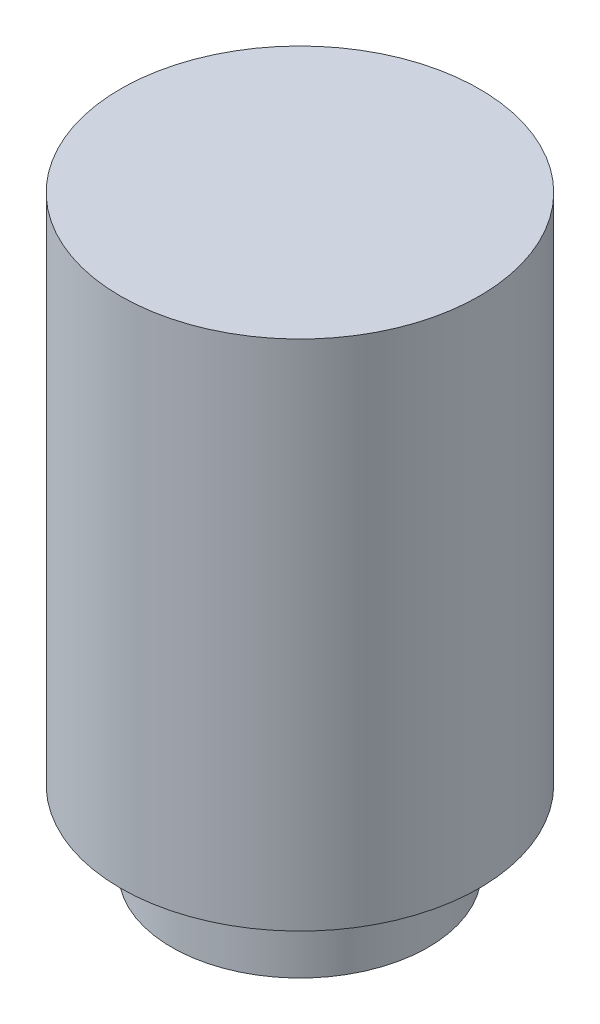
ISO-10303-21;
HEADER;
FILE_DESCRIPTION(('STEP AP214'),'2;1');
FILE_NAME('part.step','',(''),(''),'','','');
FILE_SCHEMA(('AUTOMOTIVE_DESIGN { 1 0 10303 214 1 1 1 1 }'));
ENDSEC;
DATA;
#1=APPLICATION_CONTEXT('core data for automotive mechanical design processes');
#2=APPLICATION_PROTOCOL_DEFINITION('international standard','automotive_design',2000,#1);
#3=PRODUCT_CONTEXT('',#1,'mechanical');
#4=PRODUCT('Part','Part','',(#3));
#5=PRODUCT_RELATED_PRODUCT_CATEGORY('part','',(#4));
#6=PRODUCT_DEFINITION_FORMATION('','',#4);
#7=PRODUCT_DEFINITION_CONTEXT('part definition',#1,'design');
#8=PRODUCT_DEFINITION('design','',#6,#7);
#9=PRODUCT_DEFINITION_SHAPE('','',#8);
#10=(LENGTH_UNIT() NAMED_UNIT(*) SI_UNIT(.MILLI.,.METRE.));
#11=(NAMED_UNIT(*) PLANE_ANGLE_UNIT() SI_UNIT($,.RADIAN.));
#12=(NAMED_UNIT(*) SI_UNIT($,.STERADIAN.) SOLID_ANGLE_UNIT());
#13=UNCERTAINTY_MEASURE_WITH_UNIT(LENGTH_MEASURE(1.E-05),#10,'distance_accuracy_value','');
#14=(GEOMETRIC_REPRESENTATION_CONTEXT(3) GLOBAL_UNCERTAINTY_ASSIGNED_CONTEXT((#13)) GLOBAL_UNIT_ASSIGNED_CONTEXT((#10,
#11,#12)) REPRESENTATION_CONTEXT('',''));
#15=CARTESIAN_POINT('',(0.,0.,0.));
#16=DIRECTION('',(0.,0.,1.));
#17=DIRECTION('',(1.,0.,0.));
#18=AXIS2_PLACEMENT_3D('',#15,#16,#17);
#19=CARTESIAN_POINT('',(0.,200.,0.));
#20=DIRECTION('',(0.,-1.,0.));
#21=DIRECTION('',(0.,0.,-1.));
#22=AXIS2_PLACEMENT_3D('',#19,#20,#21);
#23=CYLINDRICAL_SURFACE('',#22,70.);
#24=CARTESIAN_POINT('',(0.,200.,0.));
#25=DIRECTION('',(0.,1.,0.));
#26=DIRECTION('',(0.,0.,1.));
#27=AXIS2_PLACEMENT_3D('',#24,#25,#26);
#28=CIRCLE('',#27,70.);
#29=CARTESIAN_POINT('',(0.,200.,70.));
#30=VERTEX_POINT('',#29);
#31=EDGE_CURVE('E45',#30,#30,#28,.T.);
#32=ORIENTED_EDGE('',*,*,#31,.F.);
#33=EDGE_LOOP('',(#32));
#34=FACE_BOUND('',#33,.T.);
#35=CARTESIAN_POINT('',(0.,0.,0.));
#36=DIRECTION('',(0.,1.,0.));
#37=DIRECTION('',(0.,0.,1.));
#38=AXIS2_PLACEMENT_3D('',#35,#36,#37);
#39=CIRCLE('',#38,70.);
#40=CARTESIAN_POINT('',(0.,0.,70.));
#41=VERTEX_POINT('',#40);
#42=EDGE_CURVE('E36',#41,#41,#39,.T.);
#43=ORIENTED_EDGE('',*,*,#42,.T.);
#44=EDGE_LOOP('',(#43));
#45=FACE_BOUND('',#44,.T.);
#46=ADVANCED_FACE('F33',(#34,#45),#23,.T.);
#47=CARTESIAN_POINT('',(0.,200.,0.));
#48=DIRECTION('',(0.,1.,0.));
#49=DIRECTION('',(0.,0.,1.));
#50=AXIS2_PLACEMENT_3D('',#47,#48,#49);
#51=PLANE('',#50);
#52=ORIENTED_EDGE('',*,*,#31,.T.);
#53=EDGE_LOOP('',(#52));
#54=FACE_BOUND('',#53,.T.);
#55=ADVANCED_FACE('F62',(#54),#51,.T.);
#56=CARTESIAN_POINT('',(0.,0.,0.));
#57=DIRECTION('',(0.,1.,0.));
#58=DIRECTION('',(0.,0.,1.));
#59=AXIS2_PLACEMENT_3D('',#56,#57,#58);
#60=PLANE('',#59);
#61=CARTESIAN_POINT('',(0.,0.,0.));
#62=DIRECTION('',(0.,-1.,0.));
#63=DIRECTION('',(0.,0.,-1.));
#64=AXIS2_PLACEMENT_3D('',#61,#62,#63);
#65=CIRCLE('',#64,50.);
#66=CARTESIAN_POINT('',(0.,0.,-50.));
#67=VERTEX_POINT('',#66);
#68=EDGE_CURVE('E40',#67,#67,#65,.T.);
#69=ORIENTED_EDGE('',*,*,#68,.F.);
#70=EDGE_LOOP('',(#69));
#71=FACE_BOUND('',#70,.T.);
#72=ORIENTED_EDGE('',*,*,#42,.F.);
#73=EDGE_LOOP('',(#72));
#74=FACE_BOUND('',#73,.T.);
#75=ADVANCED_FACE('F59',(#71,#74),#60,.F.);
#76=CARTESIAN_POINT('',(0.,-30.,0.));
#77=DIRECTION('',(0.,1.,0.));
#78=DIRECTION('',(0.,0.,1.));
#79=AXIS2_PLACEMENT_3D('',#76,#77,#78);
#80=CYLINDRICAL_SURFACE('',#79,50.);
#81=CARTESIAN_POINT('',(0.,-30.,0.));
#82=DIRECTION('',(0.,-1.,0.));
#83=DIRECTION('',(0.,0.,-1.));
#84=AXIS2_PLACEMENT_3D('',#81,#82,#83);
#85=CIRCLE('',#84,50.);
#86=CARTESIAN_POINT('',(0.,-30.,-50.));
#87=VERTEX_POINT('',#86);
#88=EDGE_CURVE('E50',#87,#87,#85,.T.);
#89=ORIENTED_EDGE('',*,*,#88,.F.);
#90=EDGE_LOOP('',(#89));
#91=FACE_BOUND('',#90,.T.);
#92=ORIENTED_EDGE('',*,*,#68,.T.);
#93=EDGE_LOOP('',(#92));
#94=FACE_BOUND('',#93,.T.);
#95=ADVANCED_FACE('F61',(#91,#94),#80,.T.);
#96=CARTESIAN_POINT('',(0.,-30.,0.));
#97=DIRECTION('',(0.,-1.,0.));
#98=DIRECTION('',(0.,0.,-1.));
#99=AXIS2_PLACEMENT_3D('',#96,#97,#98);
#100=PLANE('',#99);
#101=CARTESIAN_POINT('',(0.,-30.,0.));
#102=DIRECTION('',(0.,-1.,0.));
#103=DIRECTION('',(0.,0.,-1.));
#104=AXIS2_PLACEMENT_3D('',#101,#102,#103);
#105=CIRCLE('',#104,30.);
#106=CARTESIAN_POINT('',(0.,-30.,-30.));
#107=VERTEX_POINT('',#106);
#108=EDGE_CURVE('E10',#107,#107,#105,.T.);
#109=ORIENTED_EDGE('',*,*,#108,.F.);
#110=EDGE_LOOP('',(#109));
#111=FACE_BOUND('',#110,.T.);
#112=ORIENTED_EDGE('',*,*,#88,.T.);
#113=EDGE_LOOP('',(#112));
#114=FACE_BOUND('',#113,.T.);
#115=ADVANCED_FACE('F68',(#111,#114),#100,.T.);
#116=CARTESIAN_POINT('',(0.,-40.,0.));
#117=DIRECTION('',(0.,1.,0.));
#118=DIRECTION('',(0.,0.,1.));
#119=AXIS2_PLACEMENT_3D('',#116,#117,#118);
#120=CYLINDRICAL_SURFACE('',#119,30.);
#121=CARTESIAN_POINT('',(0.,-40.,0.));
#122=DIRECTION('',(0.,-1.,0.));
#123=DIRECTION('',(0.,0.,-1.));
#124=AXIS2_PLACEMENT_3D('',#121,#122,#123);
#125=CIRCLE('',#124,30.);
#126=CARTESIAN_POINT('',(0.,-40.,-30.));
#127=VERTEX_POINT('',#126);
#128=EDGE_CURVE('E49',#127,#127,#125,.T.);
#129=ORIENTED_EDGE('',*,*,#128,.F.);
#130=EDGE_LOOP('',(#129));
#131=FACE_BOUND('',#130,.T.);
#132=ORIENTED_EDGE('',*,*,#108,.T.);
#133=EDGE_LOOP('',(#132));
#134=FACE_BOUND('',#133,.T.);
#135=ADVANCED_FACE('F100',(#131,#134),#120,.T.);
#136=CARTESIAN_POINT('',(0.,-40.,0.));
#137=DIRECTION('',(0.,-1.,0.));
#138=DIRECTION('',(0.,0.,-1.));
#139=AXIS2_PLACEMENT_3D('',#136,#137,#138);
#140=PLANE('',#139);
#141=ORIENTED_EDGE('',*,*,#128,.T.);
#142=EDGE_LOOP('',(#141));
#143=FACE_BOUND('',#142,.T.);
#144=ADVANCED_FACE('F110',(#143),#140,.T.);
#145=CLOSED_SHELL('',(#46,#55,#75,#95,#115,#135,#144));
#146=MANIFOLD_SOLID_BREP('B2',#145);
#147=ADVANCED_BREP_SHAPE_REPRESENTATION('',(#18,#146),#14);
#148=SHAPE_DEFINITION_REPRESENTATION(#9,#147);
ENDSEC;
END-ISO-10303-21;
